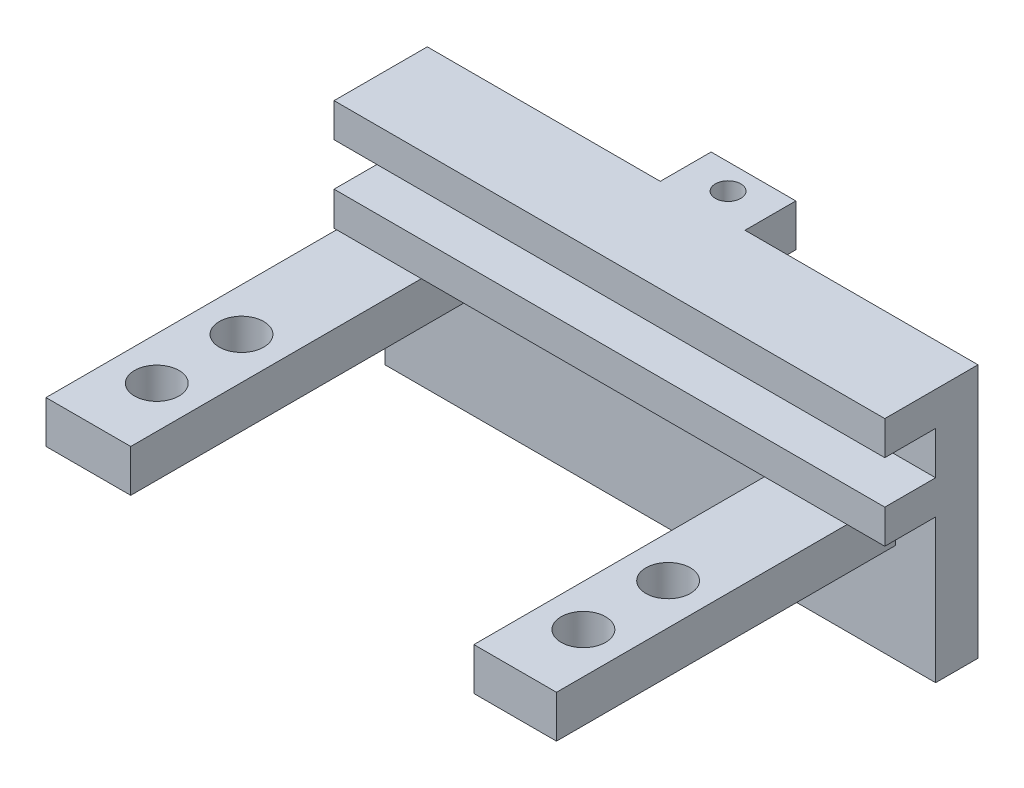
ISO-10303-21;
HEADER;
FILE_DESCRIPTION(('STEP AP214'),'2;1');
FILE_NAME('part.step','',(''),(''),'','','');
FILE_SCHEMA(('AUTOMOTIVE_DESIGN { 1 0 10303 214 1 1 1 1 }'));
ENDSEC;
DATA;
#1=APPLICATION_CONTEXT('core data for automotive mechanical design processes');
#2=APPLICATION_PROTOCOL_DEFINITION('international standard','automotive_design',2000,#1);
#3=PRODUCT_CONTEXT('',#1,'mechanical');
#4=PRODUCT('Part','Part','',(#3));
#5=PRODUCT_RELATED_PRODUCT_CATEGORY('part','',(#4));
#6=PRODUCT_DEFINITION_FORMATION('','',#4);
#7=PRODUCT_DEFINITION_CONTEXT('part definition',#1,'design');
#8=PRODUCT_DEFINITION('design','',#6,#7);
#9=PRODUCT_DEFINITION_SHAPE('','',#8);
#10=(LENGTH_UNIT() NAMED_UNIT(*) SI_UNIT(.MILLI.,.METRE.));
#11=(NAMED_UNIT(*) PLANE_ANGLE_UNIT() SI_UNIT($,.RADIAN.));
#12=(NAMED_UNIT(*) SI_UNIT($,.STERADIAN.) SOLID_ANGLE_UNIT());
#13=UNCERTAINTY_MEASURE_WITH_UNIT(LENGTH_MEASURE(1.E-05),#10,'distance_accuracy_value','');
#14=(GEOMETRIC_REPRESENTATION_CONTEXT(3) GLOBAL_UNCERTAINTY_ASSIGNED_CONTEXT((#13)) GLOBAL_UNIT_ASSIGNED_CONTEXT((#10,
#11,#12)) REPRESENTATION_CONTEXT('',''));
#15=CARTESIAN_POINT('',(0.,0.,0.));
#16=DIRECTION('',(0.,0.,1.));
#17=DIRECTION('',(1.,0.,0.));
#18=AXIS2_PLACEMENT_3D('',#15,#16,#17);
#19=CARTESIAN_POINT('',(0.,0.,0.));
#20=DIRECTION('',(0.,0.,1.));
#21=DIRECTION('',(1.,0.,0.));
#22=AXIS2_PLACEMENT_3D('',#19,#20,#21);
#23=PLANE('',#22);
#24=DIRECTION('',(0.,1.,0.));
#25=VECTOR('',#24,1.);
#26=CARTESIAN_POINT('',(-7.50000000000002,10.,0.));
#27=LINE('',#26,#25);
#28=CARTESIAN_POINT('',(-7.50000000000002,10.,0.));
#29=VERTEX_POINT('',#28);
#30=CARTESIAN_POINT('',(-7.50000000000002,15.,0.));
#31=VERTEX_POINT('',#30);
#32=EDGE_CURVE('E210',#29,#31,#27,.T.);
#33=ORIENTED_EDGE('',*,*,#32,.F.);
#34=DIRECTION('',(1.,0.,0.));
#35=VECTOR('',#34,1.);
#36=CARTESIAN_POINT('',(-7.50000000000002,10.,0.));
#37=LINE('',#36,#35);
#38=CARTESIAN_POINT('',(2.49999999999998,10.,0.));
#39=VERTEX_POINT('',#38);
#40=EDGE_CURVE('E195',#29,#39,#37,.T.);
#41=ORIENTED_EDGE('',*,*,#40,.T.);
#42=DIRECTION('',(0.,1.,0.));
#43=VECTOR('',#42,1.);
#44=CARTESIAN_POINT('',(2.49999999999998,10.,0.));
#45=LINE('',#44,#43);
#46=CARTESIAN_POINT('',(2.49999999999998,15.,0.));
#47=VERTEX_POINT('',#46);
#48=EDGE_CURVE('E220',#39,#47,#45,.T.);
#49=ORIENTED_EDGE('',*,*,#48,.T.);
#50=DIRECTION('',(-1.,0.,0.));
#51=VECTOR('',#50,1.);
#52=CARTESIAN_POINT('',(-30.,15.,0.));
#53=LINE('',#52,#51);
#54=CARTESIAN_POINT('',(30.,15.,0.));
#55=VERTEX_POINT('',#54);
#56=EDGE_CURVE('E432',#55,#47,#53,.T.);
#57=ORIENTED_EDGE('',*,*,#56,.F.);
#58=DIRECTION('',(0.,1.,0.));
#59=VECTOR('',#58,1.);
#60=CARTESIAN_POINT('',(30.,15.,0.));
#61=LINE('',#60,#59);
#62=CARTESIAN_POINT('',(30.,-15.,0.));
#63=VERTEX_POINT('',#62);
#64=EDGE_CURVE('E421',#63,#55,#61,.T.);
#65=ORIENTED_EDGE('',*,*,#64,.F.);
#66=DIRECTION('',(1.,0.,0.));
#67=VECTOR('',#66,1.);
#68=CARTESIAN_POINT('',(-30.,-15.,0.));
#69=LINE('',#68,#67);
#70=CARTESIAN_POINT('',(-35.,-15.,0.));
#71=VERTEX_POINT('',#70);
#72=EDGE_CURVE('E436',#71,#63,#69,.T.);
#73=ORIENTED_EDGE('',*,*,#72,.F.);
#74=DIRECTION('',(0.,-1.,0.));
#75=VECTOR('',#74,1.);
#76=CARTESIAN_POINT('',(-35.,15.,0.));
#77=LINE('',#76,#75);
#78=CARTESIAN_POINT('',(-35.,15.,0.));
#79=VERTEX_POINT('',#78);
#80=EDGE_CURVE('E290',#79,#71,#77,.T.);
#81=ORIENTED_EDGE('',*,*,#80,.F.);
#82=EDGE_CURVE('E218',#31,#79,#53,.T.);
#83=ORIENTED_EDGE('',*,*,#82,.F.);
#84=EDGE_LOOP('',(#33,#41,#49,#57,#65,#73,#81,#83));
#85=FACE_BOUND('',#84,.T.);
#86=ADVANCED_FACE('F41',(#85),#23,.F.);
#87=CARTESIAN_POINT('',(0.,0.,5.));
#88=DIRECTION('',(0.,0.,1.));
#89=DIRECTION('',(1.,0.,0.));
#90=AXIS2_PLACEMENT_3D('',#87,#88,#89);
#91=PLANE('',#90);
#92=DIRECTION('',(0.,1.,0.));
#93=VECTOR('',#92,1.);
#94=CARTESIAN_POINT('',(-35.,-15.,5.));
#95=LINE('',#94,#93);
#96=CARTESIAN_POINT('',(-35.,1.64999999999999,5.));
#97=VERTEX_POINT('',#96);
#98=CARTESIAN_POINT('',(-35.,1.95,5.));
#99=VERTEX_POINT('',#98);
#100=EDGE_CURVE('E257',#97,#99,#95,.T.);
#101=ORIENTED_EDGE('',*,*,#100,.F.);
#102=DIRECTION('',(-1.,0.,0.));
#103=VECTOR('',#102,1.);
#104=CARTESIAN_POINT('',(-30.,1.64999999999999,5.));
#105=LINE('',#104,#103);
#106=CARTESIAN_POINT('',(-25.,1.64999999999999,5.));
#107=VERTEX_POINT('',#106);
#108=EDGE_CURVE('E67',#107,#97,#105,.T.);
#109=ORIENTED_EDGE('',*,*,#108,.F.);
#110=DIRECTION('',(0.,1.,0.));
#111=VECTOR('',#110,1.);
#112=CARTESIAN_POINT('',(-25.,-3.35000000000001,5.));
#113=LINE('',#112,#111);
#114=CARTESIAN_POINT('',(-25.,-3.35000000000001,5.));
#115=VERTEX_POINT('',#114);
#116=EDGE_CURVE('E365',#115,#107,#113,.T.);
#117=ORIENTED_EDGE('',*,*,#116,.F.);
#118=DIRECTION('',(1.,0.,0.));
#119=VECTOR('',#118,1.);
#120=CARTESIAN_POINT('',(-30.,-3.35000000000001,5.));
#121=LINE('',#120,#119);
#122=CARTESIAN_POINT('',(-35.,-3.35000000000001,5.));
#123=VERTEX_POINT('',#122);
#124=EDGE_CURVE('E347',#123,#115,#121,.T.);
#125=ORIENTED_EDGE('',*,*,#124,.F.);
#126=CARTESIAN_POINT('',(-35.,-15.,5.));
#127=VERTEX_POINT('',#126);
#128=EDGE_CURVE('E258',#127,#123,#95,.T.);
#129=ORIENTED_EDGE('',*,*,#128,.F.);
#130=DIRECTION('',(1.,0.,0.));
#131=VECTOR('',#130,1.);
#132=CARTESIAN_POINT('',(-30.,-15.,5.));
#133=LINE('',#132,#131);
#134=CARTESIAN_POINT('',(30.,-15.,5.));
#135=VERTEX_POINT('',#134);
#136=EDGE_CURVE('E425',#127,#135,#133,.T.);
#137=ORIENTED_EDGE('',*,*,#136,.T.);
#138=DIRECTION('',(0.,1.,0.));
#139=VECTOR('',#138,1.);
#140=CARTESIAN_POINT('',(30.,15.,5.));
#141=LINE('',#140,#139);
#142=CARTESIAN_POINT('',(30.,1.95,5.));
#143=VERTEX_POINT('',#142);
#144=EDGE_CURVE('E422',#135,#143,#141,.T.);
#145=ORIENTED_EDGE('',*,*,#144,.T.);
#146=DIRECTION('',(1.,0.,0.));
#147=VECTOR('',#146,1.);
#148=CARTESIAN_POINT('',(-30.,1.95,5.));
#149=LINE('',#148,#147);
#150=EDGE_CURVE('E389',#99,#143,#149,.T.);
#151=ORIENTED_EDGE('',*,*,#150,.F.);
#152=EDGE_LOOP('',(#101,#109,#117,#125,#129,#137,#145,#151));
#153=FACE_BOUND('',#152,.T.);
#154=DIRECTION('',(0.,-1.,0.));
#155=VECTOR('',#154,1.);
#156=CARTESIAN_POINT('',(15.5,1.64999999999999,5.));
#157=LINE('',#156,#155);
#158=CARTESIAN_POINT('',(15.5,1.64999999999999,5.));
#159=VERTEX_POINT('',#158);
#160=CARTESIAN_POINT('',(15.5,-3.35000000000001,5.));
#161=VERTEX_POINT('',#160);
#162=EDGE_CURVE('E234',#159,#161,#157,.T.);
#163=ORIENTED_EDGE('',*,*,#162,.F.);
#164=DIRECTION('',(-1.,0.,0.));
#165=VECTOR('',#164,1.);
#166=CARTESIAN_POINT('',(22.25,1.64999999999999,5.));
#167=LINE('',#166,#165);
#168=CARTESIAN_POINT('',(25.25,1.64999999999999,5.));
#169=VERTEX_POINT('',#168);
#170=EDGE_CURVE('E339',#169,#159,#167,.T.);
#171=ORIENTED_EDGE('',*,*,#170,.F.);
#172=DIRECTION('',(0.,1.,0.));
#173=VECTOR('',#172,1.);
#174=CARTESIAN_POINT('',(25.25,-3.35000000000001,5.));
#175=LINE('',#174,#173);
#176=CARTESIAN_POINT('',(25.25,-3.35000000000001,5.));
#177=VERTEX_POINT('',#176);
#178=EDGE_CURVE('E327',#177,#169,#175,.T.);
#179=ORIENTED_EDGE('',*,*,#178,.F.);
#180=DIRECTION('',(1.,0.,0.));
#181=VECTOR('',#180,1.);
#182=CARTESIAN_POINT('',(22.25,-3.35000000000001,5.));
#183=LINE('',#182,#181);
#184=EDGE_CURVE('E344',#161,#177,#183,.T.);
#185=ORIENTED_EDGE('',*,*,#184,.F.);
#186=EDGE_LOOP('',(#163,#171,#179,#185));
#187=FACE_BOUND('',#186,.T.);
#188=ADVANCED_FACE('F469',(#153,#187),#91,.T.);
#189=CARTESIAN_POINT('',(30.,15.,5.));
#190=DIRECTION('',(-1.,0.,0.));
#191=DIRECTION('',(0.,-1.,0.));
#192=AXIS2_PLACEMENT_3D('',#189,#190,#191);
#193=PLANE('',#192);
#194=ORIENTED_EDGE('',*,*,#64,.T.);
#195=DIRECTION('',(0.,0.,-1.));
#196=VECTOR('',#195,1.);
#197=CARTESIAN_POINT('',(30.,15.,5.));
#198=LINE('',#197,#196);
#199=CARTESIAN_POINT('',(30.,15.,11.));
#200=VERTEX_POINT('',#199);
#201=EDGE_CURVE('E11',#200,#55,#198,.T.);
#202=ORIENTED_EDGE('',*,*,#201,.F.);
#203=DIRECTION('',(0.,1.,0.));
#204=VECTOR('',#203,1.);
#205=CARTESIAN_POINT('',(30.,0.,11.));
#206=LINE('',#205,#204);
#207=CARTESIAN_POINT('',(30.,11.,11.));
#208=VERTEX_POINT('',#207);
#209=EDGE_CURVE('E407',#208,#200,#206,.T.);
#210=ORIENTED_EDGE('',*,*,#209,.F.);
#211=DIRECTION('',(0.,0.,-1.));
#212=VECTOR('',#211,1.);
#213=CARTESIAN_POINT('',(30.,11.,11.));
#214=LINE('',#213,#212);
#215=CARTESIAN_POINT('',(30.,11.,5.));
#216=VERTEX_POINT('',#215);
#217=EDGE_CURVE('E414',#208,#216,#214,.T.);
#218=ORIENTED_EDGE('',*,*,#217,.T.);
#219=CARTESIAN_POINT('',(30.,5.95,5.));
#220=VERTEX_POINT('',#219);
#221=EDGE_CURVE('E426',#220,#216,#141,.T.);
#222=ORIENTED_EDGE('',*,*,#221,.F.);
#223=DIRECTION('',(0.,0.,-1.));
#224=VECTOR('',#223,1.);
#225=CARTESIAN_POINT('',(30.,5.95,11.));
#226=LINE('',#225,#224);
#227=CARTESIAN_POINT('',(30.,5.95,11.));
#228=VERTEX_POINT('',#227);
#229=EDGE_CURVE('E381',#228,#220,#226,.T.);
#230=ORIENTED_EDGE('',*,*,#229,.F.);
#231=DIRECTION('',(0.,-1.,0.));
#232=VECTOR('',#231,1.);
#233=CARTESIAN_POINT('',(30.,5.95,11.));
#234=LINE('',#233,#232);
#235=CARTESIAN_POINT('',(30.,1.95,11.));
#236=VERTEX_POINT('',#235);
#237=EDGE_CURVE('E398',#228,#236,#234,.T.);
#238=ORIENTED_EDGE('',*,*,#237,.T.);
#239=DIRECTION('',(0.,0.,-1.));
#240=VECTOR('',#239,1.);
#241=CARTESIAN_POINT('',(30.,1.95,11.));
#242=LINE('',#241,#240);
#243=EDGE_CURVE('E377',#236,#143,#242,.T.);
#244=ORIENTED_EDGE('',*,*,#243,.T.);
#245=ORIENTED_EDGE('',*,*,#144,.F.);
#246=DIRECTION('',(0.,0.,-1.));
#247=VECTOR('',#246,1.);
#248=CARTESIAN_POINT('',(30.,-15.,5.));
#249=LINE('',#248,#247);
#250=EDGE_CURVE('E51',#135,#63,#249,.T.);
#251=ORIENTED_EDGE('',*,*,#250,.T.);
#252=EDGE_LOOP('',(#194,#202,#210,#218,#222,#230,#238,#244,#245,#251));
#253=FACE_BOUND('',#252,.T.);
#254=ADVANCED_FACE('F43',(#253),#193,.F.);
#255=CARTESIAN_POINT('',(-30.,15.,5.));
#256=DIRECTION('',(0.,-1.,0.));
#257=DIRECTION('',(0.,0.,-1.));
#258=AXIS2_PLACEMENT_3D('',#255,#256,#257);
#259=PLANE('',#258);
#260=ORIENTED_EDGE('',*,*,#56,.T.);
#261=DIRECTION('',(0.,0.,-1.));
#262=VECTOR('',#261,1.);
#263=CARTESIAN_POINT('',(2.49999999999998,15.,0.));
#264=LINE('',#263,#262);
#265=CARTESIAN_POINT('',(2.49999999999998,15.,-6.));
#266=VERTEX_POINT('',#265);
#267=EDGE_CURVE('E59',#47,#266,#264,.T.);
#268=ORIENTED_EDGE('',*,*,#267,.T.);
#269=DIRECTION('',(-1.,0.,0.));
#270=VECTOR('',#269,1.);
#271=CARTESIAN_POINT('',(2.49999999999998,15.,-6.));
#272=LINE('',#271,#270);
#273=CARTESIAN_POINT('',(-7.50000000000002,15.,-6.));
#274=VERTEX_POINT('',#273);
#275=EDGE_CURVE('E214',#266,#274,#272,.T.);
#276=ORIENTED_EDGE('',*,*,#275,.T.);
#277=DIRECTION('',(0.,0.,1.));
#278=VECTOR('',#277,1.);
#279=CARTESIAN_POINT('',(-7.50000000000002,15.,-6.));
#280=LINE('',#279,#278);
#281=EDGE_CURVE('E499',#274,#31,#280,.T.);
#282=ORIENTED_EDGE('',*,*,#281,.T.);
#283=ORIENTED_EDGE('',*,*,#82,.T.);
#284=DIRECTION('',(0.,0.,-1.));
#285=VECTOR('',#284,1.);
#286=CARTESIAN_POINT('',(-35.,15.,11.));
#287=LINE('',#286,#285);
#288=CARTESIAN_POINT('',(-35.,15.,11.));
#289=VERTEX_POINT('',#288);
#290=EDGE_CURVE('E286',#289,#79,#287,.T.);
#291=ORIENTED_EDGE('',*,*,#290,.F.);
#292=DIRECTION('',(-1.,0.,0.));
#293=VECTOR('',#292,1.);
#294=CARTESIAN_POINT('',(0.,15.,11.));
#295=LINE('',#294,#293);
#296=EDGE_CURVE('E411',#200,#289,#295,.T.);
#297=ORIENTED_EDGE('',*,*,#296,.F.);
#298=ORIENTED_EDGE('',*,*,#201,.T.);
#299=EDGE_LOOP('',(#260,#268,#276,#282,#283,#291,#297,#298));
#300=FACE_BOUND('',#299,.T.);
#301=CARTESIAN_POINT('',(-2.50000000000002,15.,-3.));
#302=DIRECTION('',(0.,1.,0.));
#303=DIRECTION('',(0.,0.,1.));
#304=AXIS2_PLACEMENT_3D('',#301,#302,#303);
#305=CIRCLE('',#304,1.5);
#306=CARTESIAN_POINT('',(-2.50000000000002,15.,-1.5));
#307=VERTEX_POINT('',#306);
#308=EDGE_CURVE('E492',#307,#307,#305,.T.);
#309=ORIENTED_EDGE('',*,*,#308,.F.);
#310=EDGE_LOOP('',(#309));
#311=FACE_BOUND('',#310,.T.);
#312=ADVANCED_FACE('F482',(#300,#311),#259,.F.);
#313=CARTESIAN_POINT('',(-30.,-15.,5.));
#314=DIRECTION('',(0.,1.,0.));
#315=DIRECTION('',(0.,0.,1.));
#316=AXIS2_PLACEMENT_3D('',#313,#314,#315);
#317=PLANE('',#316);
#318=ORIENTED_EDGE('',*,*,#72,.T.);
#319=ORIENTED_EDGE('',*,*,#250,.F.);
#320=ORIENTED_EDGE('',*,*,#136,.F.);
#321=DIRECTION('',(0.,0.,1.));
#322=VECTOR('',#321,1.);
#323=CARTESIAN_POINT('',(-35.,-15.,0.));
#324=LINE('',#323,#322);
#325=EDGE_CURVE('E294',#71,#127,#324,.T.);
#326=ORIENTED_EDGE('',*,*,#325,.F.);
#327=EDGE_LOOP('',(#318,#319,#320,#326));
#328=FACE_BOUND('',#327,.T.);
#329=ADVANCED_FACE('F480',(#328),#317,.F.);
#330=DIRECTION('',(1.,0.,0.));
#331=VECTOR('',#330,1.);
#332=CARTESIAN_POINT('',(-30.,5.95,5.));
#333=LINE('',#332,#331);
#334=CARTESIAN_POINT('',(-35.,5.95,5.));
#335=VERTEX_POINT('',#334);
#336=EDGE_CURVE('E386',#335,#220,#333,.T.);
#337=ORIENTED_EDGE('',*,*,#336,.T.);
#338=ORIENTED_EDGE('',*,*,#221,.T.);
#339=DIRECTION('',(1.,0.,0.));
#340=VECTOR('',#339,1.);
#341=CARTESIAN_POINT('',(0.,11.,5.));
#342=LINE('',#341,#340);
#343=CARTESIAN_POINT('',(-35.,11.,5.));
#344=VERTEX_POINT('',#343);
#345=EDGE_CURVE('E394',#344,#216,#342,.T.);
#346=ORIENTED_EDGE('',*,*,#345,.F.);
#347=DIRECTION('',(0.,1.,0.));
#348=VECTOR('',#347,1.);
#349=CARTESIAN_POINT('',(-35.,5.95,5.));
#350=LINE('',#349,#348);
#351=EDGE_CURVE('E274',#335,#344,#350,.T.);
#352=ORIENTED_EDGE('',*,*,#351,.F.);
#353=EDGE_LOOP('',(#337,#338,#346,#352));
#354=FACE_BOUND('',#353,.T.);
#355=ADVANCED_FACE('F477',(#354),#91,.T.);
#356=CARTESIAN_POINT('',(0.,11.,11.));
#357=DIRECTION('',(0.,1.,0.));
#358=DIRECTION('',(0.,0.,1.));
#359=AXIS2_PLACEMENT_3D('',#356,#357,#358);
#360=PLANE('',#359);
#361=ORIENTED_EDGE('',*,*,#345,.T.);
#362=ORIENTED_EDGE('',*,*,#217,.F.);
#363=DIRECTION('',(1.,0.,0.));
#364=VECTOR('',#363,1.);
#365=CARTESIAN_POINT('',(0.,11.,11.));
#366=LINE('',#365,#364);
#367=CARTESIAN_POINT('',(-35.,11.,11.));
#368=VERTEX_POINT('',#367);
#369=EDGE_CURVE('E404',#368,#208,#366,.T.);
#370=ORIENTED_EDGE('',*,*,#369,.F.);
#371=DIRECTION('',(0.,0.,1.));
#372=VECTOR('',#371,1.);
#373=CARTESIAN_POINT('',(-35.,11.,5.));
#374=LINE('',#373,#372);
#375=EDGE_CURVE('E278',#344,#368,#374,.T.);
#376=ORIENTED_EDGE('',*,*,#375,.F.);
#377=EDGE_LOOP('',(#361,#362,#370,#376));
#378=FACE_BOUND('',#377,.T.);
#379=ADVANCED_FACE('F569',(#378),#360,.F.);
#380=CARTESIAN_POINT('',(0.,0.,11.));
#381=DIRECTION('',(0.,0.,1.));
#382=DIRECTION('',(1.,0.,0.));
#383=AXIS2_PLACEMENT_3D('',#380,#381,#382);
#384=PLANE('',#383);
#385=ORIENTED_EDGE('',*,*,#296,.T.);
#386=DIRECTION('',(0.,1.,0.));
#387=VECTOR('',#386,1.);
#388=CARTESIAN_POINT('',(-35.,11.,11.));
#389=LINE('',#388,#387);
#390=EDGE_CURVE('E282',#368,#289,#389,.T.);
#391=ORIENTED_EDGE('',*,*,#390,.F.);
#392=ORIENTED_EDGE('',*,*,#369,.T.);
#393=ORIENTED_EDGE('',*,*,#209,.T.);
#394=EDGE_LOOP('',(#385,#391,#392,#393));
#395=FACE_BOUND('',#394,.T.);
#396=ADVANCED_FACE('F563',(#395),#384,.T.);
#397=CARTESIAN_POINT('',(-30.,1.95,11.));
#398=DIRECTION('',(0.,1.,0.));
#399=DIRECTION('',(-1.,0.,0.));
#400=AXIS2_PLACEMENT_3D('',#397,#398,#399);
#401=PLANE('',#400);
#402=ORIENTED_EDGE('',*,*,#150,.T.);
#403=ORIENTED_EDGE('',*,*,#243,.F.);
#404=DIRECTION('',(1.,0.,0.));
#405=VECTOR('',#404,1.);
#406=CARTESIAN_POINT('',(-30.,1.95,11.));
#407=LINE('',#406,#405);
#408=CARTESIAN_POINT('',(-35.,1.95,11.));
#409=VERTEX_POINT('',#408);
#410=EDGE_CURVE('E390',#409,#236,#407,.T.);
#411=ORIENTED_EDGE('',*,*,#410,.F.);
#412=DIRECTION('',(0.,0.,1.));
#413=VECTOR('',#412,1.);
#414=CARTESIAN_POINT('',(-35.,1.95,5.));
#415=LINE('',#414,#413);
#416=EDGE_CURVE('E262',#99,#409,#415,.T.);
#417=ORIENTED_EDGE('',*,*,#416,.F.);
#418=EDGE_LOOP('',(#402,#403,#411,#417));
#419=FACE_BOUND('',#418,.T.);
#420=ADVANCED_FACE('F560',(#419),#401,.F.);
#421=CARTESIAN_POINT('',(-30.,5.95,11.));
#422=DIRECTION('',(0.,1.,0.));
#423=DIRECTION('',(-1.,0.,0.));
#424=AXIS2_PLACEMENT_3D('',#421,#422,#423);
#425=PLANE('',#424);
#426=ORIENTED_EDGE('',*,*,#336,.F.);
#427=DIRECTION('',(0.,0.,-1.));
#428=VECTOR('',#427,1.);
#429=CARTESIAN_POINT('',(-35.,5.95,11.));
#430=LINE('',#429,#428);
#431=CARTESIAN_POINT('',(-35.,5.95,11.));
#432=VERTEX_POINT('',#431);
#433=EDGE_CURVE('E270',#432,#335,#430,.T.);
#434=ORIENTED_EDGE('',*,*,#433,.F.);
#435=DIRECTION('',(1.,0.,0.));
#436=VECTOR('',#435,1.);
#437=CARTESIAN_POINT('',(-30.,5.95,11.));
#438=LINE('',#437,#436);
#439=EDGE_CURVE('E385',#432,#228,#438,.T.);
#440=ORIENTED_EDGE('',*,*,#439,.T.);
#441=ORIENTED_EDGE('',*,*,#229,.T.);
#442=EDGE_LOOP('',(#426,#434,#440,#441));
#443=FACE_BOUND('',#442,.T.);
#444=ADVANCED_FACE('F553',(#443),#425,.T.);
#445=CARTESIAN_POINT('',(0.,0.,11.));
#446=DIRECTION('',(0.,0.,-1.));
#447=DIRECTION('',(-1.,0.,0.));
#448=AXIS2_PLACEMENT_3D('',#445,#446,#447);
#449=PLANE('',#448);
#450=ORIENTED_EDGE('',*,*,#410,.T.);
#451=ORIENTED_EDGE('',*,*,#237,.F.);
#452=ORIENTED_EDGE('',*,*,#439,.F.);
#453=DIRECTION('',(0.,1.,0.));
#454=VECTOR('',#453,1.);
#455=CARTESIAN_POINT('',(-35.,1.95,11.));
#456=LINE('',#455,#454);
#457=EDGE_CURVE('E266',#409,#432,#456,.T.);
#458=ORIENTED_EDGE('',*,*,#457,.F.);
#459=EDGE_LOOP('',(#450,#451,#452,#458));
#460=FACE_BOUND('',#459,.T.);
#461=ADVANCED_FACE('F545',(#460),#449,.F.);
#462=CARTESIAN_POINT('',(-30.,-3.35000000000001,45.));
#463=DIRECTION('',(0.,1.,0.));
#464=DIRECTION('',(0.,0.,1.));
#465=AXIS2_PLACEMENT_3D('',#462,#463,#464);
#466=PLANE('',#465);
#467=CARTESIAN_POINT('',(-29.925,-3.35000000000001,37.));
#468=DIRECTION('',(0.,-1.,0.));
#469=DIRECTION('',(0.,0.,-1.));
#470=AXIS2_PLACEMENT_3D('',#467,#468,#469);
#471=CIRCLE('',#470,2.625);
#472=CARTESIAN_POINT('',(-29.925,-3.35000000000001,34.375));
#473=VERTEX_POINT('',#472);
#474=EDGE_CURVE('E298',#473,#473,#471,.T.);
#475=ORIENTED_EDGE('',*,*,#474,.F.);
#476=EDGE_LOOP('',(#475));
#477=FACE_BOUND('',#476,.T.);
#478=CARTESIAN_POINT('',(-29.925,-3.35000000000001,27.));
#479=DIRECTION('',(0.,-1.,0.));
#480=DIRECTION('',(0.,0.,-1.));
#481=AXIS2_PLACEMENT_3D('',#478,#479,#480);
#482=CIRCLE('',#481,2.625);
#483=CARTESIAN_POINT('',(-29.925,-3.35000000000001,24.375));
#484=VERTEX_POINT('',#483);
#485=EDGE_CURVE('E304',#484,#484,#482,.T.);
#486=ORIENTED_EDGE('',*,*,#485,.F.);
#487=EDGE_LOOP('',(#486));
#488=FACE_BOUND('',#487,.T.);
#489=ORIENTED_EDGE('',*,*,#124,.T.);
#490=DIRECTION('',(0.,0.,-1.));
#491=VECTOR('',#490,1.);
#492=CARTESIAN_POINT('',(-25.,-3.35000000000001,45.));
#493=LINE('',#492,#491);
#494=CARTESIAN_POINT('',(-25.,-3.35000000000001,45.));
#495=VERTEX_POINT('',#494);
#496=EDGE_CURVE('E373',#495,#115,#493,.T.);
#497=ORIENTED_EDGE('',*,*,#496,.F.);
#498=DIRECTION('',(1.,0.,0.));
#499=VECTOR('',#498,1.);
#500=CARTESIAN_POINT('',(-30.,-3.35000000000001,45.));
#501=LINE('',#500,#499);
#502=CARTESIAN_POINT('',(-35.,-3.35000000000001,45.));
#503=VERTEX_POINT('',#502);
#504=EDGE_CURVE('E352',#503,#495,#501,.T.);
#505=ORIENTED_EDGE('',*,*,#504,.F.);
#506=DIRECTION('',(0.,0.,1.));
#507=VECTOR('',#506,1.);
#508=CARTESIAN_POINT('',(-35.,-3.35000000000001,5.));
#509=LINE('',#508,#507);
#510=EDGE_CURVE('E253',#123,#503,#509,.T.);
#511=ORIENTED_EDGE('',*,*,#510,.F.);
#512=EDGE_LOOP('',(#489,#497,#505,#511));
#513=FACE_BOUND('',#512,.T.);
#514=ADVANCED_FACE('F543',(#477,#488,#513),#466,.F.);
#515=CARTESIAN_POINT('',(-25.,-3.35000000000001,45.));
#516=DIRECTION('',(-1.,0.,0.));
#517=DIRECTION('',(0.,-1.,0.));
#518=AXIS2_PLACEMENT_3D('',#515,#516,#517);
#519=PLANE('',#518);
#520=ORIENTED_EDGE('',*,*,#116,.T.);
#521=DIRECTION('',(0.,0.,-1.));
#522=VECTOR('',#521,1.);
#523=CARTESIAN_POINT('',(-25.,1.64999999999999,45.));
#524=LINE('',#523,#522);
#525=CARTESIAN_POINT('',(-25.,1.64999999999999,45.));
#526=VERTEX_POINT('',#525);
#527=EDGE_CURVE('E361',#526,#107,#524,.T.);
#528=ORIENTED_EDGE('',*,*,#527,.F.);
#529=DIRECTION('',(0.,1.,0.));
#530=VECTOR('',#529,1.);
#531=CARTESIAN_POINT('',(-25.,-3.35000000000001,45.));
#532=LINE('',#531,#530);
#533=EDGE_CURVE('E355',#495,#526,#532,.T.);
#534=ORIENTED_EDGE('',*,*,#533,.F.);
#535=ORIENTED_EDGE('',*,*,#496,.T.);
#536=EDGE_LOOP('',(#520,#528,#534,#535));
#537=FACE_BOUND('',#536,.T.);
#538=ADVANCED_FACE('F542',(#537),#519,.F.);
#539=CARTESIAN_POINT('',(-30.,1.64999999999999,45.));
#540=DIRECTION('',(0.,-1.,0.));
#541=DIRECTION('',(0.,0.,-1.));
#542=AXIS2_PLACEMENT_3D('',#539,#540,#541);
#543=PLANE('',#542);
#544=CARTESIAN_POINT('',(-29.925,1.65,37.));
#545=DIRECTION('',(0.,-1.,0.));
#546=DIRECTION('',(0.,0.,-1.));
#547=AXIS2_PLACEMENT_3D('',#544,#545,#546);
#548=CIRCLE('',#547,2.625);
#549=CARTESIAN_POINT('',(-29.925,1.65,34.375));
#550=VERTEX_POINT('',#549);
#551=EDGE_CURVE('E45',#550,#550,#548,.T.);
#552=ORIENTED_EDGE('',*,*,#551,.T.);
#553=EDGE_LOOP('',(#552));
#554=FACE_BOUND('',#553,.T.);
#555=CARTESIAN_POINT('',(-29.925,1.65,27.));
#556=DIRECTION('',(0.,-1.,0.));
#557=DIRECTION('',(0.,0.,-1.));
#558=AXIS2_PLACEMENT_3D('',#555,#556,#557);
#559=CIRCLE('',#558,2.625);
#560=CARTESIAN_POINT('',(-29.925,1.65,24.375));
#561=VERTEX_POINT('',#560);
#562=EDGE_CURVE('E322',#561,#561,#559,.T.);
#563=ORIENTED_EDGE('',*,*,#562,.T.);
#564=EDGE_LOOP('',(#563));
#565=FACE_BOUND('',#564,.T.);
#566=ORIENTED_EDGE('',*,*,#108,.T.);
#567=DIRECTION('',(0.,0.,-1.));
#568=VECTOR('',#567,1.);
#569=CARTESIAN_POINT('',(-35.,1.64999999999999,45.));
#570=LINE('',#569,#568);
#571=CARTESIAN_POINT('',(-35.,1.64999999999999,45.));
#572=VERTEX_POINT('',#571);
#573=EDGE_CURVE('E250',#572,#97,#570,.T.);
#574=ORIENTED_EDGE('',*,*,#573,.F.);
#575=DIRECTION('',(-1.,0.,0.));
#576=VECTOR('',#575,1.);
#577=CARTESIAN_POINT('',(-30.,1.64999999999999,45.));
#578=LINE('',#577,#576);
#579=EDGE_CURVE('E358',#526,#572,#578,.T.);
#580=ORIENTED_EDGE('',*,*,#579,.F.);
#581=ORIENTED_EDGE('',*,*,#527,.T.);
#582=EDGE_LOOP('',(#566,#574,#580,#581));
#583=FACE_BOUND('',#582,.T.);
#584=ADVANCED_FACE('F449',(#554,#565,#583),#543,.F.);
#585=CARTESIAN_POINT('',(0.,0.,45.));
#586=DIRECTION('',(0.,0.,-1.));
#587=DIRECTION('',(-1.,0.,0.));
#588=AXIS2_PLACEMENT_3D('',#585,#586,#587);
#589=PLANE('',#588);
#590=ORIENTED_EDGE('',*,*,#579,.T.);
#591=DIRECTION('',(0.,1.,0.));
#592=VECTOR('',#591,1.);
#593=CARTESIAN_POINT('',(-35.,-3.35000000000001,45.));
#594=LINE('',#593,#592);
#595=EDGE_CURVE('E246',#503,#572,#594,.T.);
#596=ORIENTED_EDGE('',*,*,#595,.F.);
#597=ORIENTED_EDGE('',*,*,#504,.T.);
#598=ORIENTED_EDGE('',*,*,#533,.T.);
#599=EDGE_LOOP('',(#590,#596,#597,#598));
#600=FACE_BOUND('',#599,.T.);
#601=ADVANCED_FACE('F535',(#600),#589,.F.);
#602=CARTESIAN_POINT('',(22.25,1.64999999999999,45.));
#603=DIRECTION('',(0.,-1.,0.));
#604=DIRECTION('',(1.,0.,0.));
#605=AXIS2_PLACEMENT_3D('',#602,#603,#604);
#606=PLANE('',#605);
#607=CARTESIAN_POINT('',(20.425,1.65,27.));
#608=DIRECTION('',(0.,-1.,0.));
#609=DIRECTION('',(1.,0.,0.));
#610=AXIS2_PLACEMENT_3D('',#607,#608,#609);
#611=CIRCLE('',#610,2.625);
#612=CARTESIAN_POINT('',(23.05,1.65,27.));
#613=VERTEX_POINT('',#612);
#614=EDGE_CURVE('E318',#613,#613,#611,.T.);
#615=ORIENTED_EDGE('',*,*,#614,.T.);
#616=EDGE_LOOP('',(#615));
#617=FACE_BOUND('',#616,.T.);
#618=CARTESIAN_POINT('',(20.425,1.65,37.));
#619=DIRECTION('',(0.,-1.,0.));
#620=DIRECTION('',(1.,0.,0.));
#621=AXIS2_PLACEMENT_3D('',#618,#619,#620);
#622=CIRCLE('',#621,2.625);
#623=CARTESIAN_POINT('',(23.05,1.65,37.));
#624=VERTEX_POINT('',#623);
#625=EDGE_CURVE('E314',#624,#624,#622,.T.);
#626=ORIENTED_EDGE('',*,*,#625,.T.);
#627=EDGE_LOOP('',(#626));
#628=FACE_BOUND('',#627,.T.);
#629=ORIENTED_EDGE('',*,*,#170,.T.);
#630=DIRECTION('',(0.,0.,-1.));
#631=VECTOR('',#630,1.);
#632=CARTESIAN_POINT('',(15.5,1.64999999999999,45.));
#633=LINE('',#632,#631);
#634=CARTESIAN_POINT('',(15.5,1.64999999999999,45.));
#635=VERTEX_POINT('',#634);
#636=EDGE_CURVE('E230',#635,#159,#633,.T.);
#637=ORIENTED_EDGE('',*,*,#636,.F.);
#638=DIRECTION('',(-1.,0.,0.));
#639=VECTOR('',#638,1.);
#640=CARTESIAN_POINT('',(22.25,1.64999999999999,45.));
#641=LINE('',#640,#639);
#642=CARTESIAN_POINT('',(25.25,1.64999999999999,45.));
#643=VERTEX_POINT('',#642);
#644=EDGE_CURVE('E340',#643,#635,#641,.T.);
#645=ORIENTED_EDGE('',*,*,#644,.F.);
#646=DIRECTION('',(0.,0.,1.));
#647=VECTOR('',#646,1.);
#648=CARTESIAN_POINT('',(25.25,1.64999999999999,5.));
#649=LINE('',#648,#647);
#650=EDGE_CURVE('E331',#169,#643,#649,.T.);
#651=ORIENTED_EDGE('',*,*,#650,.F.);
#652=EDGE_LOOP('',(#629,#637,#645,#651));
#653=FACE_BOUND('',#652,.T.);
#654=ADVANCED_FACE('F731',(#617,#628,#653),#606,.F.);
#655=CARTESIAN_POINT('',(22.25,-3.35000000000001,45.));
#656=DIRECTION('',(0.,1.,0.));
#657=DIRECTION('',(-1.,0.,0.));
#658=AXIS2_PLACEMENT_3D('',#655,#656,#657);
#659=PLANE('',#658);
#660=CARTESIAN_POINT('',(20.425,-3.35000000000001,27.));
#661=DIRECTION('',(0.,-1.,0.));
#662=DIRECTION('',(0.,0.,-1.));
#663=AXIS2_PLACEMENT_3D('',#660,#661,#662);
#664=CIRCLE('',#663,2.625);
#665=CARTESIAN_POINT('',(20.425,-3.35000000000001,24.375));
#666=VERTEX_POINT('',#665);
#667=EDGE_CURVE('E299',#666,#666,#664,.T.);
#668=ORIENTED_EDGE('',*,*,#667,.F.);
#669=EDGE_LOOP('',(#668));
#670=FACE_BOUND('',#669,.T.);
#671=CARTESIAN_POINT('',(20.425,-3.35000000000001,37.));
#672=DIRECTION('',(0.,-1.,0.));
#673=DIRECTION('',(0.,0.,-1.));
#674=AXIS2_PLACEMENT_3D('',#671,#672,#673);
#675=CIRCLE('',#674,2.625);
#676=CARTESIAN_POINT('',(20.425,-3.35000000000001,34.375));
#677=VERTEX_POINT('',#676);
#678=EDGE_CURVE('E303',#677,#677,#675,.T.);
#679=ORIENTED_EDGE('',*,*,#678,.F.);
#680=EDGE_LOOP('',(#679));
#681=FACE_BOUND('',#680,.T.);
#682=ORIENTED_EDGE('',*,*,#184,.T.);
#683=DIRECTION('',(0.,0.,-1.));
#684=VECTOR('',#683,1.);
#685=CARTESIAN_POINT('',(25.25,-3.35000000000001,45.));
#686=LINE('',#685,#684);
#687=CARTESIAN_POINT('',(25.25,-3.35000000000001,45.));
#688=VERTEX_POINT('',#687);
#689=EDGE_CURVE('E323',#688,#177,#686,.T.);
#690=ORIENTED_EDGE('',*,*,#689,.F.);
#691=DIRECTION('',(1.,0.,0.));
#692=VECTOR('',#691,1.);
#693=CARTESIAN_POINT('',(22.25,-3.35000000000001,45.));
#694=LINE('',#693,#692);
#695=CARTESIAN_POINT('',(15.5,-3.35000000000001,45.));
#696=VERTEX_POINT('',#695);
#697=EDGE_CURVE('E343',#696,#688,#694,.T.);
#698=ORIENTED_EDGE('',*,*,#697,.F.);
#699=DIRECTION('',(0.,0.,1.));
#700=VECTOR('',#699,1.);
#701=CARTESIAN_POINT('',(15.5,-3.35000000000001,5.));
#702=LINE('',#701,#700);
#703=EDGE_CURVE('E238',#161,#696,#702,.T.);
#704=ORIENTED_EDGE('',*,*,#703,.F.);
#705=EDGE_LOOP('',(#682,#690,#698,#704));
#706=FACE_BOUND('',#705,.T.);
#707=ADVANCED_FACE('F720',(#670,#681,#706),#659,.F.);
#708=CARTESIAN_POINT('',(0.,0.,45.));
#709=DIRECTION('',(0.,0.,1.));
#710=DIRECTION('',(1.,0.,0.));
#711=AXIS2_PLACEMENT_3D('',#708,#709,#710);
#712=PLANE('',#711);
#713=ORIENTED_EDGE('',*,*,#697,.T.);
#714=DIRECTION('',(0.,-1.,0.));
#715=VECTOR('',#714,1.);
#716=CARTESIAN_POINT('',(25.25,1.64999999999999,45.));
#717=LINE('',#716,#715);
#718=EDGE_CURVE('E335',#643,#688,#717,.T.);
#719=ORIENTED_EDGE('',*,*,#718,.F.);
#720=ORIENTED_EDGE('',*,*,#644,.T.);
#721=DIRECTION('',(0.,1.,0.));
#722=VECTOR('',#721,1.);
#723=CARTESIAN_POINT('',(15.5,-3.35000000000001,45.));
#724=LINE('',#723,#722);
#725=EDGE_CURVE('E242',#696,#635,#724,.T.);
#726=ORIENTED_EDGE('',*,*,#725,.F.);
#727=EDGE_LOOP('',(#713,#719,#720,#726));
#728=FACE_BOUND('',#727,.T.);
#729=ADVANCED_FACE('F632',(#728),#712,.T.);
#730=CARTESIAN_POINT('',(25.25,0.,0.));
#731=DIRECTION('',(1.,0.,0.));
#732=DIRECTION('',(0.,0.,-1.));
#733=AXIS2_PLACEMENT_3D('',#730,#731,#732);
#734=PLANE('',#733);
#735=ORIENTED_EDGE('',*,*,#689,.T.);
#736=ORIENTED_EDGE('',*,*,#178,.T.);
#737=ORIENTED_EDGE('',*,*,#650,.T.);
#738=ORIENTED_EDGE('',*,*,#718,.T.);
#739=EDGE_LOOP('',(#735,#736,#737,#738));
#740=FACE_BOUND('',#739,.T.);
#741=ADVANCED_FACE('F623',(#740),#734,.T.);
#742=CARTESIAN_POINT('',(20.425,15.,37.));
#743=DIRECTION('',(0.,-1.,0.));
#744=DIRECTION('',(0.,0.,-1.));
#745=AXIS2_PLACEMENT_3D('',#742,#743,#744);
#746=CYLINDRICAL_SURFACE('',#745,2.625);
#747=ORIENTED_EDGE('',*,*,#678,.T.);
#748=EDGE_LOOP('',(#747));
#749=FACE_BOUND('',#748,.T.);
#750=ORIENTED_EDGE('',*,*,#625,.F.);
#751=EDGE_LOOP('',(#750));
#752=FACE_BOUND('',#751,.T.);
#753=ADVANCED_FACE('F613',(#749,#752),#746,.F.);
#754=CARTESIAN_POINT('',(20.425,15.,27.));
#755=DIRECTION('',(0.,-1.,0.));
#756=DIRECTION('',(0.,0.,-1.));
#757=AXIS2_PLACEMENT_3D('',#754,#755,#756);
#758=CYLINDRICAL_SURFACE('',#757,2.625);
#759=ORIENTED_EDGE('',*,*,#667,.T.);
#760=EDGE_LOOP('',(#759));
#761=FACE_BOUND('',#760,.T.);
#762=ORIENTED_EDGE('',*,*,#614,.F.);
#763=EDGE_LOOP('',(#762));
#764=FACE_BOUND('',#763,.T.);
#765=ADVANCED_FACE('F464',(#761,#764),#758,.F.);
#766=CARTESIAN_POINT('',(-29.925,15.,27.));
#767=DIRECTION('',(0.,-1.,0.));
#768=DIRECTION('',(0.,0.,-1.));
#769=AXIS2_PLACEMENT_3D('',#766,#767,#768);
#770=CYLINDRICAL_SURFACE('',#769,2.625);
#771=ORIENTED_EDGE('',*,*,#485,.T.);
#772=EDGE_LOOP('',(#771));
#773=FACE_BOUND('',#772,.T.);
#774=ORIENTED_EDGE('',*,*,#562,.F.);
#775=EDGE_LOOP('',(#774));
#776=FACE_BOUND('',#775,.T.);
#777=ADVANCED_FACE('F454',(#773,#776),#770,.F.);
#778=CARTESIAN_POINT('',(-29.925,15.,37.));
#779=DIRECTION('',(0.,-1.,0.));
#780=DIRECTION('',(0.,0.,-1.));
#781=AXIS2_PLACEMENT_3D('',#778,#779,#780);
#782=CYLINDRICAL_SURFACE('',#781,2.625);
#783=ORIENTED_EDGE('',*,*,#474,.T.);
#784=EDGE_LOOP('',(#783));
#785=FACE_BOUND('',#784,.T.);
#786=ORIENTED_EDGE('',*,*,#551,.F.);
#787=EDGE_LOOP('',(#786));
#788=FACE_BOUND('',#787,.T.);
#789=ADVANCED_FACE('F451',(#785,#788),#782,.F.);
#790=CARTESIAN_POINT('',(-35.,0.,0.));
#791=DIRECTION('',(1.,0.,0.));
#792=DIRECTION('',(0.,1.,0.));
#793=AXIS2_PLACEMENT_3D('',#790,#791,#792);
#794=PLANE('',#793);
#795=ORIENTED_EDGE('',*,*,#128,.T.);
#796=ORIENTED_EDGE('',*,*,#510,.T.);
#797=ORIENTED_EDGE('',*,*,#595,.T.);
#798=ORIENTED_EDGE('',*,*,#573,.T.);
#799=ORIENTED_EDGE('',*,*,#100,.T.);
#800=ORIENTED_EDGE('',*,*,#416,.T.);
#801=ORIENTED_EDGE('',*,*,#457,.T.);
#802=ORIENTED_EDGE('',*,*,#433,.T.);
#803=ORIENTED_EDGE('',*,*,#351,.T.);
#804=ORIENTED_EDGE('',*,*,#375,.T.);
#805=ORIENTED_EDGE('',*,*,#390,.T.);
#806=ORIENTED_EDGE('',*,*,#290,.T.);
#807=ORIENTED_EDGE('',*,*,#80,.T.);
#808=ORIENTED_EDGE('',*,*,#325,.T.);
#809=EDGE_LOOP('',(#795,#796,#797,#798,#799,#800,#801,#802,#803,#804,#805,#806,#807,#808));
#810=FACE_BOUND('',#809,.T.);
#811=ADVANCED_FACE('F453',(#810),#794,.F.);
#812=CARTESIAN_POINT('',(15.5,0.,0.));
#813=DIRECTION('',(-1.,0.,0.));
#814=DIRECTION('',(0.,0.,1.));
#815=AXIS2_PLACEMENT_3D('',#812,#813,#814);
#816=PLANE('',#815);
#817=ORIENTED_EDGE('',*,*,#636,.T.);
#818=ORIENTED_EDGE('',*,*,#162,.T.);
#819=ORIENTED_EDGE('',*,*,#703,.T.);
#820=ORIENTED_EDGE('',*,*,#725,.T.);
#821=EDGE_LOOP('',(#817,#818,#819,#820));
#822=FACE_BOUND('',#821,.T.);
#823=ADVANCED_FACE('F461',(#822),#816,.T.);
#824=CARTESIAN_POINT('',(-7.50000000000002,10.,-6.));
#825=DIRECTION('',(-1.,0.,0.));
#826=DIRECTION('',(0.,0.,1.));
#827=AXIS2_PLACEMENT_3D('',#824,#825,#826);
#828=PLANE('',#827);
#829=ORIENTED_EDGE('',*,*,#281,.F.);
#830=DIRECTION('',(0.,1.,0.));
#831=VECTOR('',#830,1.);
#832=CARTESIAN_POINT('',(-7.50000000000002,10.,-6.));
#833=LINE('',#832,#831);
#834=CARTESIAN_POINT('',(-7.50000000000002,10.,-6.));
#835=VERTEX_POINT('',#834);
#836=EDGE_CURVE('E212',#835,#274,#833,.T.);
#837=ORIENTED_EDGE('',*,*,#836,.F.);
#838=DIRECTION('',(0.,0.,1.));
#839=VECTOR('',#838,1.);
#840=CARTESIAN_POINT('',(-7.50000000000002,10.,-6.));
#841=LINE('',#840,#839);
#842=EDGE_CURVE('E199',#835,#29,#841,.T.);
#843=ORIENTED_EDGE('',*,*,#842,.T.);
#844=ORIENTED_EDGE('',*,*,#32,.T.);
#845=EDGE_LOOP('',(#829,#837,#843,#844));
#846=FACE_BOUND('',#845,.T.);
#847=ADVANCED_FACE('F209',(#846),#828,.T.);
#848=CARTESIAN_POINT('',(2.49999999999998,10.,-6.));
#849=DIRECTION('',(0.,0.,-1.));
#850=DIRECTION('',(-1.,0.,0.));
#851=AXIS2_PLACEMENT_3D('',#848,#849,#850);
#852=PLANE('',#851);
#853=ORIENTED_EDGE('',*,*,#275,.F.);
#854=DIRECTION('',(0.,1.,0.));
#855=VECTOR('',#854,1.);
#856=CARTESIAN_POINT('',(2.49999999999998,10.,-6.));
#857=LINE('',#856,#855);
#858=CARTESIAN_POINT('',(2.49999999999998,10.,-6.));
#859=VERTEX_POINT('',#858);
#860=EDGE_CURVE('E225',#859,#266,#857,.T.);
#861=ORIENTED_EDGE('',*,*,#860,.F.);
#862=DIRECTION('',(-1.,0.,0.));
#863=VECTOR('',#862,1.);
#864=CARTESIAN_POINT('',(2.49999999999998,10.,-6.));
#865=LINE('',#864,#863);
#866=EDGE_CURVE('E221',#859,#835,#865,.T.);
#867=ORIENTED_EDGE('',*,*,#866,.T.);
#868=ORIENTED_EDGE('',*,*,#836,.T.);
#869=EDGE_LOOP('',(#853,#861,#867,#868));
#870=FACE_BOUND('',#869,.T.);
#871=ADVANCED_FACE('F516',(#870),#852,.T.);
#872=CARTESIAN_POINT('',(2.49999999999998,10.,0.));
#873=DIRECTION('',(1.,0.,0.));
#874=DIRECTION('',(0.,0.,-1.));
#875=AXIS2_PLACEMENT_3D('',#872,#873,#874);
#876=PLANE('',#875);
#877=ORIENTED_EDGE('',*,*,#267,.F.);
#878=ORIENTED_EDGE('',*,*,#48,.F.);
#879=DIRECTION('',(0.,0.,-1.));
#880=VECTOR('',#879,1.);
#881=CARTESIAN_POINT('',(2.49999999999998,10.,0.));
#882=LINE('',#881,#880);
#883=EDGE_CURVE('E202',#39,#859,#882,.T.);
#884=ORIENTED_EDGE('',*,*,#883,.T.);
#885=ORIENTED_EDGE('',*,*,#860,.T.);
#886=EDGE_LOOP('',(#877,#878,#884,#885));
#887=FACE_BOUND('',#886,.T.);
#888=ADVANCED_FACE('F513',(#887),#876,.T.);
#889=CARTESIAN_POINT('',(0.,10.,0.));
#890=DIRECTION('',(0.,1.,0.));
#891=DIRECTION('',(0.,0.,1.));
#892=AXIS2_PLACEMENT_3D('',#889,#890,#891);
#893=PLANE('',#892);
#894=CARTESIAN_POINT('',(-2.50000000000002,10.,-3.));
#895=DIRECTION('',(0.,1.,0.));
#896=DIRECTION('',(0.,0.,1.));
#897=AXIS2_PLACEMENT_3D('',#894,#895,#896);
#898=CIRCLE('',#897,1.5);
#899=CARTESIAN_POINT('',(-2.50000000000002,10.,-1.5));
#900=VERTEX_POINT('',#899);
#901=EDGE_CURVE('E495',#900,#900,#898,.T.);
#902=ORIENTED_EDGE('',*,*,#901,.T.);
#903=EDGE_LOOP('',(#902));
#904=FACE_BOUND('',#903,.T.);
#905=ORIENTED_EDGE('',*,*,#842,.F.);
#906=ORIENTED_EDGE('',*,*,#866,.F.);
#907=ORIENTED_EDGE('',*,*,#883,.F.);
#908=ORIENTED_EDGE('',*,*,#40,.F.);
#909=EDGE_LOOP('',(#905,#906,#907,#908));
#910=FACE_BOUND('',#909,.T.);
#911=ADVANCED_FACE('F197',(#904,#910),#893,.F.);
#912=CARTESIAN_POINT('',(-2.50000000000002,10.,-3.));
#913=DIRECTION('',(0.,1.,0.));
#914=DIRECTION('',(0.,0.,1.));
#915=AXIS2_PLACEMENT_3D('',#912,#913,#914);
#916=CYLINDRICAL_SURFACE('',#915,1.5);
#917=ORIENTED_EDGE('',*,*,#901,.F.);
#918=EDGE_LOOP('',(#917));
#919=FACE_BOUND('',#918,.T.);
#920=ORIENTED_EDGE('',*,*,#308,.T.);
#921=EDGE_LOOP('',(#920));
#922=FACE_BOUND('',#921,.T.);
#923=ADVANCED_FACE('F854',(#919,#922),#916,.F.);
#924=CLOSED_SHELL('',(#86,#188,#254,#312,#329,#355,#379,#396,#420,#444,#461,#514,#538,#584,#601,
#654,#707,#729,#741,#753,#765,#777,#789,#811,#823,#847,#871,#888,#911,#923));
#925=MANIFOLD_SOLID_BREP('B2',#924);
#926=ADVANCED_BREP_SHAPE_REPRESENTATION('',(#18,#925),#14);
#927=SHAPE_DEFINITION_REPRESENTATION(#9,#926);
ENDSEC;
END-ISO-10303-21;
